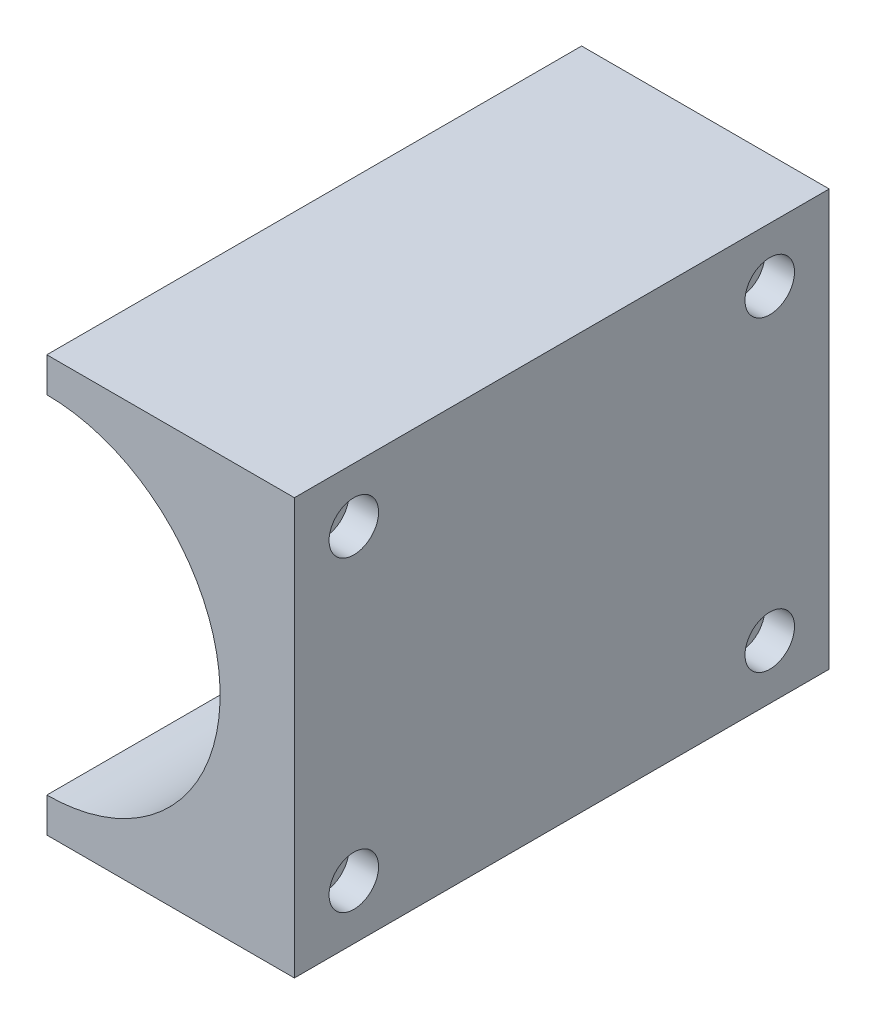
ISO-10303-21;
HEADER;
FILE_DESCRIPTION(('STEP AP214'),'2;1');
FILE_NAME('part.step','',(''),(''),'','','');
FILE_SCHEMA(('AUTOMOTIVE_DESIGN { 1 0 10303 214 1 1 1 1 }'));
ENDSEC;
DATA;
#1=APPLICATION_CONTEXT('core data for automotive mechanical design processes');
#2=APPLICATION_PROTOCOL_DEFINITION('international standard','automotive_design',2000,#1);
#3=PRODUCT_CONTEXT('',#1,'mechanical');
#4=PRODUCT('Part','Part','',(#3));
#5=PRODUCT_RELATED_PRODUCT_CATEGORY('part','',(#4));
#6=PRODUCT_DEFINITION_FORMATION('','',#4);
#7=PRODUCT_DEFINITION_CONTEXT('part definition',#1,'design');
#8=PRODUCT_DEFINITION('design','',#6,#7);
#9=PRODUCT_DEFINITION_SHAPE('','',#8);
#10=(LENGTH_UNIT() NAMED_UNIT(*) SI_UNIT(.MILLI.,.METRE.));
#11=(NAMED_UNIT(*) PLANE_ANGLE_UNIT() SI_UNIT($,.RADIAN.));
#12=(NAMED_UNIT(*) SI_UNIT($,.STERADIAN.) SOLID_ANGLE_UNIT());
#13=UNCERTAINTY_MEASURE_WITH_UNIT(LENGTH_MEASURE(1.E-05),#10,'distance_accuracy_value','');
#14=(GEOMETRIC_REPRESENTATION_CONTEXT(3) GLOBAL_UNCERTAINTY_ASSIGNED_CONTEXT((#13)) GLOBAL_UNIT_ASSIGNED_CONTEXT((#10,
#11,#12)) REPRESENTATION_CONTEXT('',''));
#15=CARTESIAN_POINT('',(0.,0.,0.));
#16=DIRECTION('',(0.,0.,1.));
#17=DIRECTION('',(1.,0.,0.));
#18=AXIS2_PLACEMENT_3D('',#15,#16,#17);
#19=CARTESIAN_POINT('',(-0.999999999999987,-21.,-102.8773976394));
#20=DIRECTION('',(-1.,0.,0.));
#21=DIRECTION('',(0.,0.,1.));
#22=AXIS2_PLACEMENT_3D('',#19,#20,#21);
#23=PLANE('',#22);
#24=DIRECTION('',(0.,0.,1.));
#25=VECTOR('',#24,1.);
#26=CARTESIAN_POINT('',(-0.999999999999987,-17.5,-54.001));
#27=LINE('',#26,#25);
#28=CARTESIAN_POINT('',(-0.999999999999987,-17.5,0.));
#29=VERTEX_POINT('',#28);
#30=CARTESIAN_POINT('',(-0.999999999999987,-17.5,-26.));
#31=VERTEX_POINT('',#30);
#32=EDGE_CURVE('E100',#29,#31,#27,.F.);
#33=ORIENTED_EDGE('',*,*,#32,.T.);
#34=DIRECTION('',(0.,-1.,0.));
#35=VECTOR('',#34,1.);
#36=CARTESIAN_POINT('',(-0.999999999999987,-21.,-26.));
#37=LINE('',#36,#35);
#38=CARTESIAN_POINT('',(-0.999999999999987,-18.5,-26.));
#39=VERTEX_POINT('',#38);
#40=EDGE_CURVE('E42',#31,#39,#37,.T.);
#41=ORIENTED_EDGE('',*,*,#40,.T.);
#42=DIRECTION('',(0.,0.,-1.));
#43=VECTOR('',#42,1.);
#44=CARTESIAN_POINT('',(-0.999999999999987,-18.5,26.3259018078045));
#45=LINE('',#44,#43);
#46=CARTESIAN_POINT('',(-0.999999999999987,-18.5,-54.));
#47=VERTEX_POINT('',#46);
#48=EDGE_CURVE('E150',#47,#39,#45,.F.);
#49=ORIENTED_EDGE('',*,*,#48,.F.);
#50=DIRECTION('',(0.,1.,0.));
#51=VECTOR('',#50,1.);
#52=CARTESIAN_POINT('',(-0.999999999999987,-21.,-54.));
#53=LINE('',#52,#51);
#54=CARTESIAN_POINT('',(-0.999999999999987,-21.,-54.));
#55=VERTEX_POINT('',#54);
#56=EDGE_CURVE('E117',#55,#47,#53,.T.);
#57=ORIENTED_EDGE('',*,*,#56,.F.);
#58=DIRECTION('',(0.,0.,1.));
#59=VECTOR('',#58,1.);
#60=CARTESIAN_POINT('',(-0.999999999999987,-21.,-102.8773976394));
#61=LINE('',#60,#59);
#62=CARTESIAN_POINT('',(-0.999999999999987,-21.,0.));
#63=VERTEX_POINT('',#62);
#64=EDGE_CURVE('E126',#55,#63,#61,.T.);
#65=ORIENTED_EDGE('',*,*,#64,.T.);
#66=DIRECTION('',(0.,-1.,0.));
#67=VECTOR('',#66,1.);
#68=CARTESIAN_POINT('',(-0.999999999999987,-21.,0.));
#69=LINE('',#68,#67);
#70=EDGE_CURVE('E112',#29,#63,#69,.T.);
#71=ORIENTED_EDGE('',*,*,#70,.F.);
#72=EDGE_LOOP('',(#33,#41,#49,#57,#65,#71));
#73=FACE_BOUND('',#72,.T.);
#74=ADVANCED_FACE('F34',(#73),#23,.T.);
#75=CARTESIAN_POINT('',(-0.999999999999987,21.,-102.8773976394));
#76=DIRECTION('',(0.,1.,0.));
#77=DIRECTION('',(-1.,0.,0.));
#78=AXIS2_PLACEMENT_3D('',#75,#76,#77);
#79=PLANE('',#78);
#80=DIRECTION('',(1.,0.,0.));
#81=VECTOR('',#80,1.);
#82=CARTESIAN_POINT('',(-0.999999999999974,21.,-53.9999999999999));
#83=LINE('',#82,#81);
#84=CARTESIAN_POINT('',(-0.999999999999987,21.,-53.9999999999999));
#85=VERTEX_POINT('',#84);
#86=CARTESIAN_POINT('',(24.,21.,-54.));
#87=VERTEX_POINT('',#86);
#88=EDGE_CURVE('E122',#85,#87,#83,.T.);
#89=ORIENTED_EDGE('',*,*,#88,.F.);
#90=DIRECTION('',(0.,0.,1.));
#91=VECTOR('',#90,1.);
#92=CARTESIAN_POINT('',(-0.999999999999987,21.,-102.8773976394));
#93=LINE('',#92,#91);
#94=CARTESIAN_POINT('',(-0.999999999999987,21.,0.));
#95=VERTEX_POINT('',#94);
#96=EDGE_CURVE('E124',#85,#95,#93,.T.);
#97=ORIENTED_EDGE('',*,*,#96,.T.);
#98=DIRECTION('',(-1.,0.,0.));
#99=VECTOR('',#98,1.);
#100=CARTESIAN_POINT('',(-0.999999999999987,21.,0.));
#101=LINE('',#100,#99);
#102=CARTESIAN_POINT('',(24.,21.,0.));
#103=VERTEX_POINT('',#102);
#104=EDGE_CURVE('E142',#103,#95,#101,.T.);
#105=ORIENTED_EDGE('',*,*,#104,.F.);
#106=DIRECTION('',(0.,0.,1.));
#107=VECTOR('',#106,1.);
#108=CARTESIAN_POINT('',(24.,21.,-102.8773976394));
#109=LINE('',#108,#107);
#110=EDGE_CURVE('E131',#87,#103,#109,.T.);
#111=ORIENTED_EDGE('',*,*,#110,.F.);
#112=EDGE_LOOP('',(#89,#97,#105,#111));
#113=FACE_BOUND('',#112,.T.);
#114=ADVANCED_FACE('F36',(#113),#79,.T.);
#115=CARTESIAN_POINT('',(24.,21.,-102.8773976394));
#116=DIRECTION('',(1.,0.,0.));
#117=DIRECTION('',(0.,1.,0.));
#118=AXIS2_PLACEMENT_3D('',#115,#116,#117);
#119=PLANE('',#118);
#120=CARTESIAN_POINT('',(24.,-15.5,-48.));
#121=DIRECTION('',(1.,0.,0.));
#122=DIRECTION('',(0.,1.,0.));
#123=AXIS2_PLACEMENT_3D('',#120,#121,#122);
#124=CIRCLE('',#123,2.5);
#125=CARTESIAN_POINT('',(24.,-13.,-48.));
#126=VERTEX_POINT('',#125);
#127=EDGE_CURVE('E175',#126,#126,#124,.T.);
#128=ORIENTED_EDGE('',*,*,#127,.F.);
#129=EDGE_LOOP('',(#128));
#130=FACE_BOUND('',#129,.T.);
#131=CARTESIAN_POINT('',(24.,-15.5,-5.99999999999995));
#132=DIRECTION('',(1.,0.,0.));
#133=DIRECTION('',(0.,1.,0.));
#134=AXIS2_PLACEMENT_3D('',#131,#132,#133);
#135=CIRCLE('',#134,2.5);
#136=CARTESIAN_POINT('',(24.,-13.,-5.99999999999995));
#137=VERTEX_POINT('',#136);
#138=EDGE_CURVE('E169',#137,#137,#135,.T.);
#139=ORIENTED_EDGE('',*,*,#138,.F.);
#140=EDGE_LOOP('',(#139));
#141=FACE_BOUND('',#140,.T.);
#142=CARTESIAN_POINT('',(24.,15.5,-48.));
#143=DIRECTION('',(1.,0.,0.));
#144=DIRECTION('',(0.,1.,0.));
#145=AXIS2_PLACEMENT_3D('',#142,#143,#144);
#146=CIRCLE('',#145,2.5);
#147=CARTESIAN_POINT('',(24.,18.,-48.));
#148=VERTEX_POINT('',#147);
#149=EDGE_CURVE('E163',#148,#148,#146,.T.);
#150=ORIENTED_EDGE('',*,*,#149,.F.);
#151=EDGE_LOOP('',(#150));
#152=FACE_BOUND('',#151,.T.);
#153=CARTESIAN_POINT('',(24.,15.5,-5.99999999999995));
#154=DIRECTION('',(1.,0.,0.));
#155=DIRECTION('',(0.,1.,0.));
#156=AXIS2_PLACEMENT_3D('',#153,#154,#155);
#157=CIRCLE('',#156,2.5);
#158=CARTESIAN_POINT('',(24.,18.,-5.99999999999995));
#159=VERTEX_POINT('',#158);
#160=EDGE_CURVE('E157',#159,#159,#157,.T.);
#161=ORIENTED_EDGE('',*,*,#160,.F.);
#162=EDGE_LOOP('',(#161));
#163=FACE_BOUND('',#162,.T.);
#164=DIRECTION('',(0.,-1.,0.));
#165=VECTOR('',#164,1.);
#166=CARTESIAN_POINT('',(24.,21.,-54.));
#167=LINE('',#166,#165);
#168=CARTESIAN_POINT('',(24.,-21.,-54.));
#169=VERTEX_POINT('',#168);
#170=EDGE_CURVE('E146',#87,#169,#167,.T.);
#171=ORIENTED_EDGE('',*,*,#170,.F.);
#172=ORIENTED_EDGE('',*,*,#110,.T.);
#173=DIRECTION('',(0.,1.,0.));
#174=VECTOR('',#173,1.);
#175=CARTESIAN_POINT('',(24.,21.,0.));
#176=LINE('',#175,#174);
#177=CARTESIAN_POINT('',(24.,-21.,0.));
#178=VERTEX_POINT('',#177);
#179=EDGE_CURVE('E127',#178,#103,#176,.T.);
#180=ORIENTED_EDGE('',*,*,#179,.F.);
#181=DIRECTION('',(0.,0.,1.));
#182=VECTOR('',#181,1.);
#183=CARTESIAN_POINT('',(24.,-21.,-102.8773976394));
#184=LINE('',#183,#182);
#185=EDGE_CURVE('E129',#169,#178,#184,.T.);
#186=ORIENTED_EDGE('',*,*,#185,.F.);
#187=EDGE_LOOP('',(#171,#172,#180,#186));
#188=FACE_BOUND('',#187,.T.);
#189=ADVANCED_FACE('F190',(#130,#141,#152,#163,#188),#119,.T.);
#190=CARTESIAN_POINT('',(24.,-21.,-102.8773976394));
#191=DIRECTION('',(0.,-1.,0.));
#192=DIRECTION('',(1.,0.,0.));
#193=AXIS2_PLACEMENT_3D('',#190,#191,#192);
#194=PLANE('',#193);
#195=DIRECTION('',(-1.,0.,0.));
#196=VECTOR('',#195,1.);
#197=CARTESIAN_POINT('',(24.,-21.,-54.));
#198=LINE('',#197,#196);
#199=EDGE_CURVE('E133',#169,#55,#198,.T.);
#200=ORIENTED_EDGE('',*,*,#199,.F.);
#201=ORIENTED_EDGE('',*,*,#185,.T.);
#202=DIRECTION('',(1.,0.,0.));
#203=VECTOR('',#202,1.);
#204=CARTESIAN_POINT('',(24.,-21.,0.));
#205=LINE('',#204,#203);
#206=EDGE_CURVE('E136',#63,#178,#205,.T.);
#207=ORIENTED_EDGE('',*,*,#206,.F.);
#208=ORIENTED_EDGE('',*,*,#64,.F.);
#209=EDGE_LOOP('',(#200,#201,#207,#208));
#210=FACE_BOUND('',#209,.T.);
#211=ADVANCED_FACE('F193',(#210),#194,.T.);
#212=DIRECTION('',(0.,0.,1.));
#213=VECTOR('',#212,1.);
#214=CARTESIAN_POINT('',(-0.999999999999987,17.5,-54.001));
#215=LINE('',#214,#213);
#216=CARTESIAN_POINT('',(-0.999999999999987,17.5,-26.));
#217=VERTEX_POINT('',#216);
#218=CARTESIAN_POINT('',(-0.999999999999987,17.5,0.));
#219=VERTEX_POINT('',#218);
#220=EDGE_CURVE('E49',#217,#219,#215,.T.);
#221=ORIENTED_EDGE('',*,*,#220,.T.);
#222=EDGE_CURVE('E139',#95,#219,#69,.T.);
#223=ORIENTED_EDGE('',*,*,#222,.F.);
#224=ORIENTED_EDGE('',*,*,#96,.F.);
#225=CARTESIAN_POINT('',(-0.999999999999987,18.5,-54.));
#226=VERTEX_POINT('',#225);
#227=EDGE_CURVE('E119',#226,#85,#53,.T.);
#228=ORIENTED_EDGE('',*,*,#227,.F.);
#229=DIRECTION('',(0.,0.,-1.));
#230=VECTOR('',#229,1.);
#231=CARTESIAN_POINT('',(-0.999999999999987,18.5,26.3259018078045));
#232=LINE('',#231,#230);
#233=CARTESIAN_POINT('',(-0.999999999999987,18.5,-26.));
#234=VERTEX_POINT('',#233);
#235=EDGE_CURVE('E57',#234,#226,#232,.T.);
#236=ORIENTED_EDGE('',*,*,#235,.F.);
#237=EDGE_CURVE('E11',#234,#217,#37,.T.);
#238=ORIENTED_EDGE('',*,*,#237,.T.);
#239=EDGE_LOOP('',(#221,#223,#224,#228,#236,#238));
#240=FACE_BOUND('',#239,.T.);
#241=ADVANCED_FACE('F225',(#240),#23,.T.);
#242=CARTESIAN_POINT('',(0.,0.,0.));
#243=DIRECTION('',(0.,0.,-1.));
#244=DIRECTION('',(-1.,0.,0.));
#245=AXIS2_PLACEMENT_3D('',#242,#243,#244);
#246=PLANE('',#245);
#247=ORIENTED_EDGE('',*,*,#222,.T.);
#248=CARTESIAN_POINT('',(-0.999999999999987,0.,0.));
#249=DIRECTION('',(0.,0.,1.));
#250=DIRECTION('',(1.,0.,0.));
#251=AXIS2_PLACEMENT_3D('',#248,#249,#250);
#252=CIRCLE('',#251,17.5);
#253=EDGE_CURVE('E105',#29,#219,#252,.T.);
#254=ORIENTED_EDGE('',*,*,#253,.F.);
#255=ORIENTED_EDGE('',*,*,#70,.T.);
#256=ORIENTED_EDGE('',*,*,#206,.T.);
#257=ORIENTED_EDGE('',*,*,#179,.T.);
#258=ORIENTED_EDGE('',*,*,#104,.T.);
#259=EDGE_LOOP('',(#247,#254,#255,#256,#257,#258));
#260=FACE_BOUND('',#259,.T.);
#261=ADVANCED_FACE('F212',(#260),#246,.F.);
#262=CARTESIAN_POINT('',(20.,27.,-54.));
#263=DIRECTION('',(0.,0.,1.));
#264=DIRECTION('',(1.,0.,0.));
#265=AXIS2_PLACEMENT_3D('',#262,#263,#264);
#266=PLANE('',#265);
#267=ORIENTED_EDGE('',*,*,#56,.T.);
#268=CARTESIAN_POINT('',(-0.999999999999987,0.,-54.));
#269=DIRECTION('',(0.,0.,-1.));
#270=DIRECTION('',(-1.,0.,0.));
#271=AXIS2_PLACEMENT_3D('',#268,#269,#270);
#272=CIRCLE('',#271,18.5);
#273=EDGE_CURVE('E104',#226,#47,#272,.T.);
#274=ORIENTED_EDGE('',*,*,#273,.F.);
#275=ORIENTED_EDGE('',*,*,#227,.T.);
#276=ORIENTED_EDGE('',*,*,#88,.T.);
#277=ORIENTED_EDGE('',*,*,#170,.T.);
#278=ORIENTED_EDGE('',*,*,#199,.T.);
#279=EDGE_LOOP('',(#267,#274,#275,#276,#277,#278));
#280=FACE_BOUND('',#279,.T.);
#281=ADVANCED_FACE('F216',(#280),#266,.F.);
#282=CARTESIAN_POINT('',(-0.999999999999959,0.,26.3259018078045));
#283=DIRECTION('',(0.,0.,-1.));
#284=DIRECTION('',(-1.,0.,0.));
#285=AXIS2_PLACEMENT_3D('',#282,#283,#284);
#286=CYLINDRICAL_SURFACE('',#285,18.5);
#287=ORIENTED_EDGE('',*,*,#235,.T.);
#288=ORIENTED_EDGE('',*,*,#273,.T.);
#289=ORIENTED_EDGE('',*,*,#48,.T.);
#290=CARTESIAN_POINT('',(-0.999999999999977,0.,-26.));
#291=DIRECTION('',(0.,0.,-1.));
#292=DIRECTION('',(0.,1.,0.));
#293=AXIS2_PLACEMENT_3D('',#290,#291,#292);
#294=CIRCLE('',#293,18.5);
#295=EDGE_CURVE('E116',#39,#234,#294,.F.);
#296=ORIENTED_EDGE('',*,*,#295,.T.);
#297=EDGE_LOOP('',(#287,#288,#289,#296));
#298=FACE_BOUND('',#297,.T.);
#299=ADVANCED_FACE('F218',(#298),#286,.F.);
#300=CARTESIAN_POINT('',(-7.49999999999998,0.,-26.));
#301=DIRECTION('',(0.,0.,-1.));
#302=DIRECTION('',(-1.,0.,0.));
#303=AXIS2_PLACEMENT_3D('',#300,#301,#302);
#304=PLANE('',#303);
#305=CARTESIAN_POINT('',(-0.999999999999987,0.,-26.));
#306=DIRECTION('',(0.,0.,-1.));
#307=DIRECTION('',(0.,1.,0.));
#308=AXIS2_PLACEMENT_3D('',#305,#306,#307);
#309=CIRCLE('',#308,17.5);
#310=EDGE_CURVE('E97',#31,#217,#309,.F.);
#311=ORIENTED_EDGE('',*,*,#310,.T.);
#312=ORIENTED_EDGE('',*,*,#237,.F.);
#313=ORIENTED_EDGE('',*,*,#295,.F.);
#314=ORIENTED_EDGE('',*,*,#40,.F.);
#315=EDGE_LOOP('',(#311,#312,#313,#314));
#316=FACE_BOUND('',#315,.T.);
#317=ADVANCED_FACE('F115',(#316),#304,.T.);
#318=CARTESIAN_POINT('',(-0.999999999999987,0.,-54.001));
#319=DIRECTION('',(0.,0.,1.));
#320=DIRECTION('',(1.,0.,0.));
#321=AXIS2_PLACEMENT_3D('',#318,#319,#320);
#322=CYLINDRICAL_SURFACE('',#321,17.5);
#323=ORIENTED_EDGE('',*,*,#253,.T.);
#324=ORIENTED_EDGE('',*,*,#220,.F.);
#325=ORIENTED_EDGE('',*,*,#310,.F.);
#326=ORIENTED_EDGE('',*,*,#32,.F.);
#327=EDGE_LOOP('',(#323,#324,#325,#326));
#328=FACE_BOUND('',#327,.T.);
#329=ADVANCED_FACE('F99',(#328),#322,.F.);
#330=CARTESIAN_POINT('',(21.,15.5,-5.99999999999995));
#331=DIRECTION('',(1.,0.,0.));
#332=DIRECTION('',(0.,1.,0.));
#333=AXIS2_PLACEMENT_3D('',#330,#331,#332);
#334=CYLINDRICAL_SURFACE('',#333,2.5);
#335=CARTESIAN_POINT('',(21.,15.5,-5.99999999999995));
#336=DIRECTION('',(1.,0.,0.));
#337=DIRECTION('',(0.,1.,0.));
#338=AXIS2_PLACEMENT_3D('',#335,#336,#337);
#339=CIRCLE('',#338,2.5);
#340=CARTESIAN_POINT('',(21.,18.,-5.99999999999995));
#341=VERTEX_POINT('',#340);
#342=EDGE_CURVE('E156',#341,#341,#339,.T.);
#343=ORIENTED_EDGE('',*,*,#342,.F.);
#344=EDGE_LOOP('',(#343));
#345=FACE_BOUND('',#344,.T.);
#346=ORIENTED_EDGE('',*,*,#160,.T.);
#347=EDGE_LOOP('',(#346));
#348=FACE_BOUND('',#347,.T.);
#349=ADVANCED_FACE('F292',(#345,#348),#334,.F.);
#350=CARTESIAN_POINT('',(21.,15.5,-5.99999999999995));
#351=DIRECTION('',(1.,0.,0.));
#352=DIRECTION('',(0.,1.,0.));
#353=AXIS2_PLACEMENT_3D('',#350,#351,#352);
#354=PLANE('',#353);
#355=ORIENTED_EDGE('',*,*,#342,.T.);
#356=EDGE_LOOP('',(#355));
#357=FACE_BOUND('',#356,.T.);
#358=ADVANCED_FACE('F299',(#357),#354,.T.);
#359=CARTESIAN_POINT('',(21.,15.5,-48.));
#360=DIRECTION('',(1.,0.,0.));
#361=DIRECTION('',(0.,1.,0.));
#362=AXIS2_PLACEMENT_3D('',#359,#360,#361);
#363=CYLINDRICAL_SURFACE('',#362,2.5);
#364=CARTESIAN_POINT('',(21.,15.5,-48.));
#365=DIRECTION('',(1.,0.,0.));
#366=DIRECTION('',(0.,1.,0.));
#367=AXIS2_PLACEMENT_3D('',#364,#365,#366);
#368=CIRCLE('',#367,2.5);
#369=CARTESIAN_POINT('',(21.,18.,-48.));
#370=VERTEX_POINT('',#369);
#371=EDGE_CURVE('E160',#370,#370,#368,.T.);
#372=ORIENTED_EDGE('',*,*,#371,.F.);
#373=EDGE_LOOP('',(#372));
#374=FACE_BOUND('',#373,.T.);
#375=ORIENTED_EDGE('',*,*,#149,.T.);
#376=EDGE_LOOP('',(#375));
#377=FACE_BOUND('',#376,.T.);
#378=ADVANCED_FACE('F308',(#374,#377),#363,.F.);
#379=CARTESIAN_POINT('',(21.,15.5,-48.));
#380=DIRECTION('',(1.,0.,0.));
#381=DIRECTION('',(0.,1.,0.));
#382=AXIS2_PLACEMENT_3D('',#379,#380,#381);
#383=PLANE('',#382);
#384=ORIENTED_EDGE('',*,*,#371,.T.);
#385=EDGE_LOOP('',(#384));
#386=FACE_BOUND('',#385,.T.);
#387=ADVANCED_FACE('F317',(#386),#383,.T.);
#388=CARTESIAN_POINT('',(21.,-15.5,-5.99999999999995));
#389=DIRECTION('',(1.,0.,0.));
#390=DIRECTION('',(0.,1.,0.));
#391=AXIS2_PLACEMENT_3D('',#388,#389,#390);
#392=CYLINDRICAL_SURFACE('',#391,2.5);
#393=CARTESIAN_POINT('',(21.,-15.5,-5.99999999999995));
#394=DIRECTION('',(1.,0.,0.));
#395=DIRECTION('',(0.,1.,0.));
#396=AXIS2_PLACEMENT_3D('',#393,#394,#395);
#397=CIRCLE('',#396,2.5);
#398=CARTESIAN_POINT('',(21.,-13.,-5.99999999999995));
#399=VERTEX_POINT('',#398);
#400=EDGE_CURVE('E166',#399,#399,#397,.T.);
#401=ORIENTED_EDGE('',*,*,#400,.F.);
#402=EDGE_LOOP('',(#401));
#403=FACE_BOUND('',#402,.T.);
#404=ORIENTED_EDGE('',*,*,#138,.T.);
#405=EDGE_LOOP('',(#404));
#406=FACE_BOUND('',#405,.T.);
#407=ADVANCED_FACE('F326',(#403,#406),#392,.F.);
#408=CARTESIAN_POINT('',(21.,-15.5,-5.99999999999995));
#409=DIRECTION('',(1.,0.,0.));
#410=DIRECTION('',(0.,1.,0.));
#411=AXIS2_PLACEMENT_3D('',#408,#409,#410);
#412=PLANE('',#411);
#413=ORIENTED_EDGE('',*,*,#400,.T.);
#414=EDGE_LOOP('',(#413));
#415=FACE_BOUND('',#414,.T.);
#416=ADVANCED_FACE('F186',(#415),#412,.T.);
#417=CARTESIAN_POINT('',(21.,-15.5,-48.));
#418=DIRECTION('',(1.,0.,0.));
#419=DIRECTION('',(0.,1.,0.));
#420=AXIS2_PLACEMENT_3D('',#417,#418,#419);
#421=CYLINDRICAL_SURFACE('',#420,2.5);
#422=CARTESIAN_POINT('',(21.,-15.5,-48.));
#423=DIRECTION('',(1.,0.,0.));
#424=DIRECTION('',(0.,1.,0.));
#425=AXIS2_PLACEMENT_3D('',#422,#423,#424);
#426=CIRCLE('',#425,2.5);
#427=CARTESIAN_POINT('',(21.,-13.,-48.));
#428=VERTEX_POINT('',#427);
#429=EDGE_CURVE('E172',#428,#428,#426,.T.);
#430=ORIENTED_EDGE('',*,*,#429,.F.);
#431=EDGE_LOOP('',(#430));
#432=FACE_BOUND('',#431,.T.);
#433=ORIENTED_EDGE('',*,*,#127,.T.);
#434=EDGE_LOOP('',(#433));
#435=FACE_BOUND('',#434,.T.);
#436=ADVANCED_FACE('F183',(#432,#435),#421,.F.);
#437=CARTESIAN_POINT('',(21.,-15.5,-48.));
#438=DIRECTION('',(1.,0.,0.));
#439=DIRECTION('',(0.,1.,0.));
#440=AXIS2_PLACEMENT_3D('',#437,#438,#439);
#441=PLANE('',#440);
#442=ORIENTED_EDGE('',*,*,#429,.T.);
#443=EDGE_LOOP('',(#442));
#444=FACE_BOUND('',#443,.T.);
#445=ADVANCED_FACE('F181',(#444),#441,.T.);
#446=CLOSED_SHELL('',(#74,#114,#189,#211,#241,#261,#281,#299,#317,#329,#349,#358,#378,#387,#407,
#416,#436,#445));
#447=MANIFOLD_SOLID_BREP('B2',#446);
#448=ADVANCED_BREP_SHAPE_REPRESENTATION('',(#18,#447),#14);
#449=SHAPE_DEFINITION_REPRESENTATION(#9,#448);
ENDSEC;
END-ISO-10303-21;
